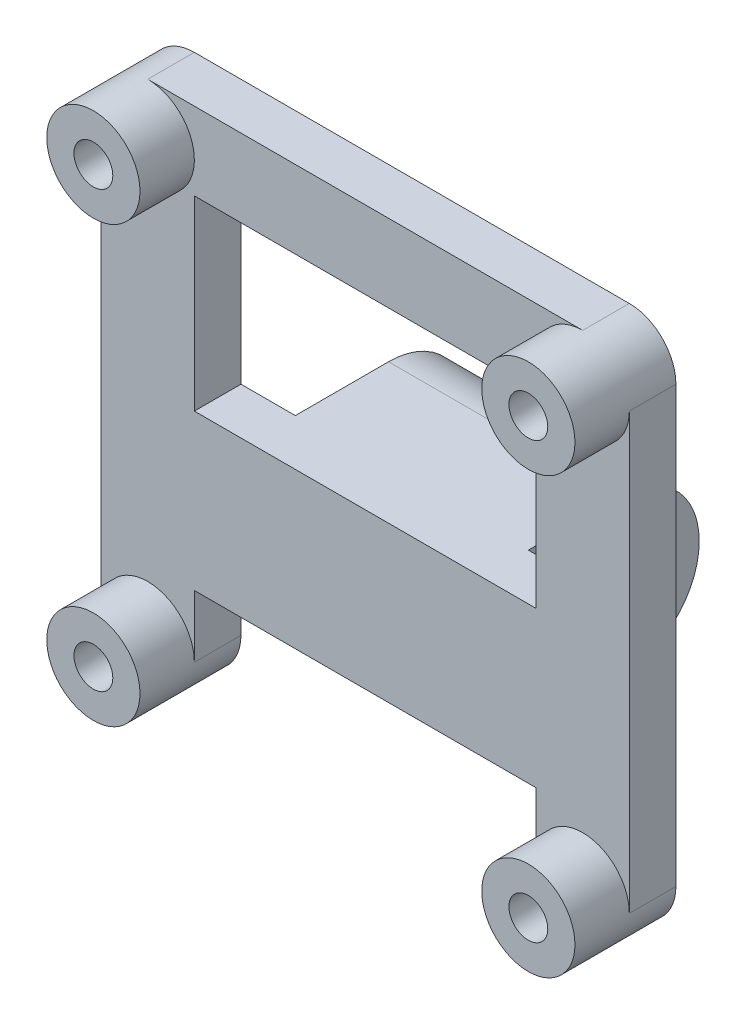
ISO-10303-21;
HEADER;
FILE_DESCRIPTION(('STEP AP214'),'2;1');
FILE_NAME('part.step','',(''),(''),'','','');
FILE_SCHEMA(('AUTOMOTIVE_DESIGN { 1 0 10303 214 1 1 1 1 }'));
ENDSEC;
DATA;
#1=APPLICATION_CONTEXT('core data for automotive mechanical design processes');
#2=APPLICATION_PROTOCOL_DEFINITION('international standard','automotive_design',2000,#1);
#3=PRODUCT_CONTEXT('',#1,'mechanical');
#4=PRODUCT('Part','Part','',(#3));
#5=PRODUCT_RELATED_PRODUCT_CATEGORY('part','',(#4));
#6=PRODUCT_DEFINITION_FORMATION('','',#4);
#7=PRODUCT_DEFINITION_CONTEXT('part definition',#1,'design');
#8=PRODUCT_DEFINITION('design','',#6,#7);
#9=PRODUCT_DEFINITION_SHAPE('','',#8);
#10=(LENGTH_UNIT() NAMED_UNIT(*) SI_UNIT(.MILLI.,.METRE.));
#11=(NAMED_UNIT(*) PLANE_ANGLE_UNIT() SI_UNIT($,.RADIAN.));
#12=(NAMED_UNIT(*) SI_UNIT($,.STERADIAN.) SOLID_ANGLE_UNIT());
#13=UNCERTAINTY_MEASURE_WITH_UNIT(LENGTH_MEASURE(1.E-05),#10,'distance_accuracy_value','');
#14=(GEOMETRIC_REPRESENTATION_CONTEXT(3) GLOBAL_UNCERTAINTY_ASSIGNED_CONTEXT((#13)) GLOBAL_UNIT_ASSIGNED_CONTEXT((#10,
#11,#12)) REPRESENTATION_CONTEXT('',''));
#15=CARTESIAN_POINT('',(0.,0.,0.));
#16=DIRECTION('',(0.,0.,1.));
#17=DIRECTION('',(1.,0.,0.));
#18=AXIS2_PLACEMENT_3D('',#15,#16,#17);
#19=CARTESIAN_POINT('',(14.,-18.,3.));
#20=DIRECTION('',(0.,0.,1.));
#21=DIRECTION('',(1.,0.,0.));
#22=AXIS2_PLACEMENT_3D('',#19,#20,#21);
#23=PLANE('',#22);
#24=DIRECTION('',(0.,-1.,0.));
#25=VECTOR('',#24,1.);
#26=CARTESIAN_POINT('',(11.,-14.,3.));
#27=LINE('',#26,#25);
#28=CARTESIAN_POINT('',(11.,-14.,3.));
#29=VERTEX_POINT('',#28);
#30=CARTESIAN_POINT('',(11.,-18.,3.));
#31=VERTEX_POINT('',#30);
#32=EDGE_CURVE('E274',#29,#31,#27,.T.);
#33=ORIENTED_EDGE('',*,*,#32,.T.);
#34=CARTESIAN_POINT('',(14.,-18.,3.));
#35=DIRECTION('',(0.,0.,1.));
#36=DIRECTION('',(1.,0.,0.));
#37=AXIS2_PLACEMENT_3D('',#34,#35,#36);
#38=CIRCLE('',#37,3.);
#39=CARTESIAN_POINT('',(17.,-18.,3.));
#40=VERTEX_POINT('',#39);
#41=EDGE_CURVE('E211',#40,#31,#38,.T.);
#42=ORIENTED_EDGE('',*,*,#41,.F.);
#43=DIRECTION('',(0.,1.,0.));
#44=VECTOR('',#43,1.);
#45=CARTESIAN_POINT('',(17.,10.,3.));
#46=LINE('',#45,#44);
#47=CARTESIAN_POINT('',(17.,10.,3.));
#48=VERTEX_POINT('',#47);
#49=EDGE_CURVE('E262',#40,#48,#46,.T.);
#50=ORIENTED_EDGE('',*,*,#49,.T.);
#51=CARTESIAN_POINT('',(14.,10.,3.));
#52=DIRECTION('',(0.,0.,1.));
#53=DIRECTION('',(1.,0.,0.));
#54=AXIS2_PLACEMENT_3D('',#51,#52,#53);
#55=CIRCLE('',#54,3.);
#56=CARTESIAN_POINT('',(14.,13.,3.));
#57=VERTEX_POINT('',#56);
#58=EDGE_CURVE('E11',#57,#48,#55,.T.);
#59=ORIENTED_EDGE('',*,*,#58,.F.);
#60=DIRECTION('',(-1.,0.,0.));
#61=VECTOR('',#60,1.);
#62=CARTESIAN_POINT('',(14.,13.,3.));
#63=LINE('',#62,#61);
#64=CARTESIAN_POINT('',(-14.,13.,3.));
#65=VERTEX_POINT('',#64);
#66=EDGE_CURVE('E265',#57,#65,#63,.T.);
#67=ORIENTED_EDGE('',*,*,#66,.T.);
#68=CARTESIAN_POINT('',(-14.,10.,3.));
#69=DIRECTION('',(0.,0.,1.));
#70=DIRECTION('',(1.,0.,0.));
#71=AXIS2_PLACEMENT_3D('',#68,#69,#70);
#72=CIRCLE('',#71,3.);
#73=CARTESIAN_POINT('',(-17.,9.99999999999999,3.));
#74=VERTEX_POINT('',#73);
#75=EDGE_CURVE('E223',#74,#65,#72,.T.);
#76=ORIENTED_EDGE('',*,*,#75,.F.);
#77=DIRECTION('',(0.,-1.,0.));
#78=VECTOR('',#77,1.);
#79=CARTESIAN_POINT('',(-17.,-14.,3.));
#80=LINE('',#79,#78);
#81=CARTESIAN_POINT('',(-17.,-18.,3.));
#82=VERTEX_POINT('',#81);
#83=EDGE_CURVE('E268',#74,#82,#80,.T.);
#84=ORIENTED_EDGE('',*,*,#83,.T.);
#85=CARTESIAN_POINT('',(-14.,-18.,3.));
#86=DIRECTION('',(0.,0.,1.));
#87=DIRECTION('',(1.,0.,0.));
#88=AXIS2_PLACEMENT_3D('',#85,#86,#87);
#89=CIRCLE('',#88,3.);
#90=CARTESIAN_POINT('',(-11.,-18.,3.));
#91=VERTEX_POINT('',#90);
#92=EDGE_CURVE('E217',#91,#82,#89,.T.);
#93=ORIENTED_EDGE('',*,*,#92,.F.);
#94=DIRECTION('',(0.,1.,0.));
#95=VECTOR('',#94,1.);
#96=CARTESIAN_POINT('',(-11.,-18.,3.));
#97=LINE('',#96,#95);
#98=CARTESIAN_POINT('',(-11.,-14.,3.));
#99=VERTEX_POINT('',#98);
#100=EDGE_CURVE('E270',#91,#99,#97,.T.);
#101=ORIENTED_EDGE('',*,*,#100,.T.);
#102=DIRECTION('',(1.,0.,0.));
#103=VECTOR('',#102,1.);
#104=CARTESIAN_POINT('',(-11.,-14.,3.));
#105=LINE('',#104,#103);
#106=EDGE_CURVE('E272',#99,#29,#105,.T.);
#107=ORIENTED_EDGE('',*,*,#106,.T.);
#108=EDGE_LOOP('',(#33,#42,#50,#59,#67,#76,#84,#93,#101,#107));
#109=FACE_BOUND('',#108,.T.);
#110=DIRECTION('',(-1.,0.,0.));
#111=VECTOR('',#110,1.);
#112=CARTESIAN_POINT('',(-11.,8.,3.));
#113=LINE('',#112,#111);
#114=CARTESIAN_POINT('',(11.,8.,3.));
#115=VERTEX_POINT('',#114);
#116=CARTESIAN_POINT('',(-11.,8.,3.));
#117=VERTEX_POINT('',#116);
#118=EDGE_CURVE('E237',#115,#117,#113,.T.);
#119=ORIENTED_EDGE('',*,*,#118,.F.);
#120=DIRECTION('',(0.,1.,0.));
#121=VECTOR('',#120,1.);
#122=CARTESIAN_POINT('',(11.,8.,3.));
#123=LINE('',#122,#121);
#124=CARTESIAN_POINT('',(11.,-3.99999999999999,3.));
#125=VERTEX_POINT('',#124);
#126=EDGE_CURVE('E235',#125,#115,#123,.T.);
#127=ORIENTED_EDGE('',*,*,#126,.F.);
#128=DIRECTION('',(1.,0.,0.));
#129=VECTOR('',#128,1.);
#130=CARTESIAN_POINT('',(11.,-3.99999999999999,3.));
#131=LINE('',#130,#129);
#132=CARTESIAN_POINT('',(-11.,-4.,3.));
#133=VERTEX_POINT('',#132);
#134=EDGE_CURVE('E242',#133,#125,#131,.T.);
#135=ORIENTED_EDGE('',*,*,#134,.F.);
#136=DIRECTION('',(0.,-1.,0.));
#137=VECTOR('',#136,1.);
#138=CARTESIAN_POINT('',(-11.,-4.,3.));
#139=LINE('',#138,#137);
#140=EDGE_CURVE('E239',#117,#133,#139,.T.);
#141=ORIENTED_EDGE('',*,*,#140,.F.);
#142=EDGE_LOOP('',(#119,#127,#135,#141));
#143=FACE_BOUND('',#142,.T.);
#144=ADVANCED_FACE('F34',(#109,#143),#23,.T.);
#145=CARTESIAN_POINT('',(14.,-18.,0.));
#146=DIRECTION('',(0.,0.,1.));
#147=DIRECTION('',(1.,0.,0.));
#148=AXIS2_PLACEMENT_3D('',#145,#146,#147);
#149=PLANE('',#148);
#150=CARTESIAN_POINT('',(14.,10.,0.));
#151=DIRECTION('',(0.,0.,1.));
#152=DIRECTION('',(1.,0.,0.));
#153=AXIS2_PLACEMENT_3D('',#150,#151,#152);
#154=CIRCLE('',#153,1.25);
#155=CARTESIAN_POINT('',(15.25,10.,0.));
#156=VERTEX_POINT('',#155);
#157=EDGE_CURVE('E196',#156,#156,#154,.T.);
#158=ORIENTED_EDGE('',*,*,#157,.T.);
#159=EDGE_LOOP('',(#158));
#160=FACE_BOUND('',#159,.T.);
#161=CARTESIAN_POINT('',(-14.,-18.,0.));
#162=DIRECTION('',(0.,0.,1.));
#163=DIRECTION('',(1.,0.,0.));
#164=AXIS2_PLACEMENT_3D('',#161,#162,#163);
#165=CIRCLE('',#164,1.25);
#166=CARTESIAN_POINT('',(-12.75,-18.,0.));
#167=VERTEX_POINT('',#166);
#168=EDGE_CURVE('E203',#167,#167,#165,.T.);
#169=ORIENTED_EDGE('',*,*,#168,.T.);
#170=EDGE_LOOP('',(#169));
#171=FACE_BOUND('',#170,.T.);
#172=CARTESIAN_POINT('',(14.,-18.,0.));
#173=DIRECTION('',(0.,0.,1.));
#174=DIRECTION('',(1.,0.,0.));
#175=AXIS2_PLACEMENT_3D('',#172,#173,#174);
#176=CIRCLE('',#175,1.25);
#177=CARTESIAN_POINT('',(15.25,-18.,0.));
#178=VERTEX_POINT('',#177);
#179=EDGE_CURVE('E188',#178,#178,#176,.T.);
#180=ORIENTED_EDGE('',*,*,#179,.T.);
#181=EDGE_LOOP('',(#180));
#182=FACE_BOUND('',#181,.T.);
#183=CARTESIAN_POINT('',(-14.,10.,0.));
#184=DIRECTION('',(0.,0.,1.));
#185=DIRECTION('',(1.,0.,0.));
#186=AXIS2_PLACEMENT_3D('',#183,#184,#185);
#187=CIRCLE('',#186,1.25);
#188=CARTESIAN_POINT('',(-12.75,10.,0.));
#189=VERTEX_POINT('',#188);
#190=EDGE_CURVE('E208',#189,#189,#187,.T.);
#191=ORIENTED_EDGE('',*,*,#190,.T.);
#192=EDGE_LOOP('',(#191));
#193=FACE_BOUND('',#192,.T.);
#194=DIRECTION('',(1.,0.,0.));
#195=VECTOR('',#194,1.);
#196=CARTESIAN_POINT('',(11.,-3.99999999999999,0.));
#197=LINE('',#196,#195);
#198=CARTESIAN_POINT('',(-11.,-4.,0.));
#199=VERTEX_POINT('',#198);
#200=CARTESIAN_POINT('',(-7.5,-4.,0.));
#201=VERTEX_POINT('',#200);
#202=EDGE_CURVE('E58',#199,#201,#197,.T.);
#203=ORIENTED_EDGE('',*,*,#202,.T.);
#204=DIRECTION('',(0.,-1.,0.));
#205=VECTOR('',#204,1.);
#206=CARTESIAN_POINT('',(-7.5,-14.,0.));
#207=LINE('',#206,#205);
#208=CARTESIAN_POINT('',(-7.5,-14.,0.));
#209=VERTEX_POINT('',#208);
#210=EDGE_CURVE('E369',#201,#209,#207,.T.);
#211=ORIENTED_EDGE('',*,*,#210,.T.);
#212=DIRECTION('',(1.,0.,0.));
#213=VECTOR('',#212,1.);
#214=CARTESIAN_POINT('',(-11.,-14.,0.));
#215=LINE('',#214,#213);
#216=CARTESIAN_POINT('',(-11.,-14.,0.));
#217=VERTEX_POINT('',#216);
#218=EDGE_CURVE('E290',#217,#209,#215,.T.);
#219=ORIENTED_EDGE('',*,*,#218,.F.);
#220=DIRECTION('',(0.,1.,0.));
#221=VECTOR('',#220,1.);
#222=CARTESIAN_POINT('',(-11.,-18.,0.));
#223=LINE('',#222,#221);
#224=CARTESIAN_POINT('',(-11.,-18.,0.));
#225=VERTEX_POINT('',#224);
#226=EDGE_CURVE('E287',#225,#217,#223,.T.);
#227=ORIENTED_EDGE('',*,*,#226,.F.);
#228=CARTESIAN_POINT('',(-14.,-18.,0.));
#229=DIRECTION('',(0.,0.,1.));
#230=DIRECTION('',(1.,0.,0.));
#231=AXIS2_PLACEMENT_3D('',#228,#229,#230);
#232=CIRCLE('',#231,3.);
#233=CARTESIAN_POINT('',(-17.,-18.,0.));
#234=VERTEX_POINT('',#233);
#235=EDGE_CURVE('E285',#234,#225,#232,.T.);
#236=ORIENTED_EDGE('',*,*,#235,.F.);
#237=DIRECTION('',(0.,-1.,0.));
#238=VECTOR('',#237,1.);
#239=CARTESIAN_POINT('',(-17.,-14.,0.));
#240=LINE('',#239,#238);
#241=CARTESIAN_POINT('',(-17.,10.,0.));
#242=VERTEX_POINT('',#241);
#243=EDGE_CURVE('E283',#242,#234,#240,.T.);
#244=ORIENTED_EDGE('',*,*,#243,.F.);
#245=CARTESIAN_POINT('',(-14.,10.,0.));
#246=DIRECTION('',(0.,0.,1.));
#247=DIRECTION('',(1.,0.,0.));
#248=AXIS2_PLACEMENT_3D('',#245,#246,#247);
#249=CIRCLE('',#248,3.);
#250=CARTESIAN_POINT('',(-14.,13.,0.));
#251=VERTEX_POINT('',#250);
#252=EDGE_CURVE('E280',#251,#242,#249,.T.);
#253=ORIENTED_EDGE('',*,*,#252,.F.);
#254=DIRECTION('',(-1.,0.,0.));
#255=VECTOR('',#254,1.);
#256=CARTESIAN_POINT('',(14.,13.,0.));
#257=LINE('',#256,#255);
#258=CARTESIAN_POINT('',(14.,13.,0.));
#259=VERTEX_POINT('',#258);
#260=EDGE_CURVE('E278',#259,#251,#257,.T.);
#261=ORIENTED_EDGE('',*,*,#260,.F.);
#262=CARTESIAN_POINT('',(14.,10.,0.));
#263=DIRECTION('',(0.,0.,1.));
#264=DIRECTION('',(-1.,0.,0.));
#265=AXIS2_PLACEMENT_3D('',#262,#263,#264);
#266=CIRCLE('',#265,3.);
#267=CARTESIAN_POINT('',(17.,10.,0.));
#268=VERTEX_POINT('',#267);
#269=EDGE_CURVE('E261',#268,#259,#266,.T.);
#270=ORIENTED_EDGE('',*,*,#269,.F.);
#271=DIRECTION('',(0.,1.,0.));
#272=VECTOR('',#271,1.);
#273=CARTESIAN_POINT('',(17.,-14.,0.));
#274=LINE('',#273,#272);
#275=CARTESIAN_POINT('',(17.,-18.,0.));
#276=VERTEX_POINT('',#275);
#277=EDGE_CURVE('E266',#276,#268,#274,.T.);
#278=ORIENTED_EDGE('',*,*,#277,.F.);
#279=CARTESIAN_POINT('',(14.,-18.,0.));
#280=DIRECTION('',(0.,0.,1.));
#281=DIRECTION('',(1.,0.,0.));
#282=AXIS2_PLACEMENT_3D('',#279,#280,#281);
#283=CIRCLE('',#282,3.);
#284=CARTESIAN_POINT('',(11.,-18.,0.));
#285=VERTEX_POINT('',#284);
#286=EDGE_CURVE('E295',#285,#276,#283,.T.);
#287=ORIENTED_EDGE('',*,*,#286,.F.);
#288=DIRECTION('',(0.,-1.,0.));
#289=VECTOR('',#288,1.);
#290=CARTESIAN_POINT('',(11.,-14.,0.));
#291=LINE('',#290,#289);
#292=CARTESIAN_POINT('',(11.,-14.,0.));
#293=VERTEX_POINT('',#292);
#294=EDGE_CURVE('E293',#293,#285,#291,.T.);
#295=ORIENTED_EDGE('',*,*,#294,.F.);
#296=CARTESIAN_POINT('',(7.5,-14.,0.));
#297=VERTEX_POINT('',#296);
#298=EDGE_CURVE('E289',#297,#293,#215,.T.);
#299=ORIENTED_EDGE('',*,*,#298,.F.);
#300=DIRECTION('',(0.,-1.,0.));
#301=VECTOR('',#300,1.);
#302=CARTESIAN_POINT('',(7.5,-14.,0.));
#303=LINE('',#302,#301);
#304=CARTESIAN_POINT('',(7.5,-4.,0.));
#305=VERTEX_POINT('',#304);
#306=EDGE_CURVE('E51',#305,#297,#303,.T.);
#307=ORIENTED_EDGE('',*,*,#306,.F.);
#308=CARTESIAN_POINT('',(11.,-4.,0.));
#309=VERTEX_POINT('',#308);
#310=EDGE_CURVE('E168',#305,#309,#197,.T.);
#311=ORIENTED_EDGE('',*,*,#310,.T.);
#312=DIRECTION('',(0.,1.,0.));
#313=VECTOR('',#312,1.);
#314=CARTESIAN_POINT('',(11.,8.,0.));
#315=LINE('',#314,#313);
#316=CARTESIAN_POINT('',(11.,8.,0.));
#317=VERTEX_POINT('',#316);
#318=EDGE_CURVE('E233',#309,#317,#315,.T.);
#319=ORIENTED_EDGE('',*,*,#318,.T.);
#320=DIRECTION('',(-1.,0.,0.));
#321=VECTOR('',#320,1.);
#322=CARTESIAN_POINT('',(-11.,8.,0.));
#323=LINE('',#322,#321);
#324=CARTESIAN_POINT('',(-11.,8.,0.));
#325=VERTEX_POINT('',#324);
#326=EDGE_CURVE('E247',#317,#325,#323,.T.);
#327=ORIENTED_EDGE('',*,*,#326,.T.);
#328=DIRECTION('',(0.,-1.,0.));
#329=VECTOR('',#328,1.);
#330=CARTESIAN_POINT('',(-11.,-4.,0.));
#331=LINE('',#330,#329);
#332=EDGE_CURVE('E250',#325,#199,#331,.T.);
#333=ORIENTED_EDGE('',*,*,#332,.T.);
#334=EDGE_LOOP('',(#203,#211,#219,#227,#236,#244,#253,#261,#270,#278,#287,#295,#299,#307,#311,
#319,#327,#333));
#335=FACE_BOUND('',#334,.T.);
#336=ADVANCED_FACE('F341',(#160,#171,#182,#193,#335),#149,.F.);
#337=CARTESIAN_POINT('',(14.,10.,3.));
#338=DIRECTION('',(0.,0.,-1.));
#339=DIRECTION('',(-1.,0.,0.));
#340=AXIS2_PLACEMENT_3D('',#337,#338,#339);
#341=CYLINDRICAL_SURFACE('',#340,3.);
#342=ORIENTED_EDGE('',*,*,#269,.T.);
#343=DIRECTION('',(0.,0.,-1.));
#344=VECTOR('',#343,1.);
#345=CARTESIAN_POINT('',(14.,13.,3.));
#346=LINE('',#345,#344);
#347=EDGE_CURVE('E321',#57,#259,#346,.T.);
#348=ORIENTED_EDGE('',*,*,#347,.F.);
#349=ORIENTED_EDGE('',*,*,#58,.T.);
#350=DIRECTION('',(0.,0.,-1.));
#351=VECTOR('',#350,1.);
#352=CARTESIAN_POINT('',(17.,10.,3.));
#353=LINE('',#352,#351);
#354=EDGE_CURVE('E43',#48,#268,#353,.T.);
#355=ORIENTED_EDGE('',*,*,#354,.T.);
#356=EDGE_LOOP('',(#342,#348,#349,#355));
#357=FACE_BOUND('',#356,.T.);
#358=CARTESIAN_POINT('',(14.,10.,6.5));
#359=DIRECTION('',(0.,0.,1.));
#360=DIRECTION('',(1.,0.,0.));
#361=AXIS2_PLACEMENT_3D('',#358,#359,#360);
#362=CIRCLE('',#361,3.);
#363=CARTESIAN_POINT('',(17.,10.,6.5));
#364=VERTEX_POINT('',#363);
#365=EDGE_CURVE('E229',#364,#364,#362,.T.);
#366=ORIENTED_EDGE('',*,*,#365,.F.);
#367=EDGE_LOOP('',(#366));
#368=FACE_BOUND('',#367,.T.);
#369=ADVANCED_FACE('F36',(#357,#368),#341,.T.);
#370=CARTESIAN_POINT('',(14.,13.,3.));
#371=DIRECTION('',(0.,-1.,0.));
#372=DIRECTION('',(1.,0.,0.));
#373=AXIS2_PLACEMENT_3D('',#370,#371,#372);
#374=PLANE('',#373);
#375=ORIENTED_EDGE('',*,*,#260,.T.);
#376=DIRECTION('',(0.,0.,-1.));
#377=VECTOR('',#376,1.);
#378=CARTESIAN_POINT('',(-14.,13.,3.));
#379=LINE('',#378,#377);
#380=EDGE_CURVE('E318',#65,#251,#379,.T.);
#381=ORIENTED_EDGE('',*,*,#380,.F.);
#382=ORIENTED_EDGE('',*,*,#66,.F.);
#383=ORIENTED_EDGE('',*,*,#347,.T.);
#384=EDGE_LOOP('',(#375,#381,#382,#383));
#385=FACE_BOUND('',#384,.T.);
#386=ADVANCED_FACE('F347',(#385),#374,.F.);
#387=CARTESIAN_POINT('',(-14.,10.,3.));
#388=DIRECTION('',(0.,0.,-1.));
#389=DIRECTION('',(-1.,0.,0.));
#390=AXIS2_PLACEMENT_3D('',#387,#388,#389);
#391=CYLINDRICAL_SURFACE('',#390,3.);
#392=ORIENTED_EDGE('',*,*,#252,.T.);
#393=DIRECTION('',(0.,0.,-1.));
#394=VECTOR('',#393,1.);
#395=CARTESIAN_POINT('',(-17.,10.,3.));
#396=LINE('',#395,#394);
#397=EDGE_CURVE('E315',#74,#242,#396,.T.);
#398=ORIENTED_EDGE('',*,*,#397,.F.);
#399=ORIENTED_EDGE('',*,*,#75,.T.);
#400=ORIENTED_EDGE('',*,*,#380,.T.);
#401=EDGE_LOOP('',(#392,#398,#399,#400));
#402=FACE_BOUND('',#401,.T.);
#403=CARTESIAN_POINT('',(-14.,10.,6.5));
#404=DIRECTION('',(0.,0.,1.));
#405=DIRECTION('',(1.,0.,0.));
#406=AXIS2_PLACEMENT_3D('',#403,#404,#405);
#407=CIRCLE('',#406,3.);
#408=CARTESIAN_POINT('',(-11.,10.,6.5));
#409=VERTEX_POINT('',#408);
#410=EDGE_CURVE('E226',#409,#409,#407,.T.);
#411=ORIENTED_EDGE('',*,*,#410,.F.);
#412=EDGE_LOOP('',(#411));
#413=FACE_BOUND('',#412,.T.);
#414=ADVANCED_FACE('F350',(#402,#413),#391,.T.);
#415=CARTESIAN_POINT('',(-17.,-14.,3.));
#416=DIRECTION('',(1.,0.,0.));
#417=DIRECTION('',(0.,1.,0.));
#418=AXIS2_PLACEMENT_3D('',#415,#416,#417);
#419=PLANE('',#418);
#420=ORIENTED_EDGE('',*,*,#243,.T.);
#421=DIRECTION('',(0.,0.,-1.));
#422=VECTOR('',#421,1.);
#423=CARTESIAN_POINT('',(-17.,-18.,3.));
#424=LINE('',#423,#422);
#425=EDGE_CURVE('E312',#82,#234,#424,.T.);
#426=ORIENTED_EDGE('',*,*,#425,.F.);
#427=ORIENTED_EDGE('',*,*,#83,.F.);
#428=ORIENTED_EDGE('',*,*,#397,.T.);
#429=EDGE_LOOP('',(#420,#426,#427,#428));
#430=FACE_BOUND('',#429,.T.);
#431=ADVANCED_FACE('F357',(#430),#419,.F.);
#432=CARTESIAN_POINT('',(-14.,-18.,3.));
#433=DIRECTION('',(0.,0.,-1.));
#434=DIRECTION('',(-1.,0.,0.));
#435=AXIS2_PLACEMENT_3D('',#432,#433,#434);
#436=CYLINDRICAL_SURFACE('',#435,3.);
#437=ORIENTED_EDGE('',*,*,#235,.T.);
#438=DIRECTION('',(0.,0.,-1.));
#439=VECTOR('',#438,1.);
#440=CARTESIAN_POINT('',(-11.,-18.,3.));
#441=LINE('',#440,#439);
#442=EDGE_CURVE('E309',#91,#225,#441,.T.);
#443=ORIENTED_EDGE('',*,*,#442,.F.);
#444=ORIENTED_EDGE('',*,*,#92,.T.);
#445=ORIENTED_EDGE('',*,*,#425,.T.);
#446=EDGE_LOOP('',(#437,#443,#444,#445));
#447=FACE_BOUND('',#446,.T.);
#448=CARTESIAN_POINT('',(-14.,-18.,6.5));
#449=DIRECTION('',(0.,0.,1.));
#450=DIRECTION('',(1.,0.,0.));
#451=AXIS2_PLACEMENT_3D('',#448,#449,#450);
#452=CIRCLE('',#451,3.);
#453=CARTESIAN_POINT('',(-11.,-18.,6.5));
#454=VERTEX_POINT('',#453);
#455=EDGE_CURVE('E220',#454,#454,#452,.T.);
#456=ORIENTED_EDGE('',*,*,#455,.F.);
#457=EDGE_LOOP('',(#456));
#458=FACE_BOUND('',#457,.T.);
#459=ADVANCED_FACE('F361',(#447,#458),#436,.T.);
#460=CARTESIAN_POINT('',(-11.,-18.,3.));
#461=DIRECTION('',(-1.,0.,0.));
#462=DIRECTION('',(0.,-1.,0.));
#463=AXIS2_PLACEMENT_3D('',#460,#461,#462);
#464=PLANE('',#463);
#465=ORIENTED_EDGE('',*,*,#226,.T.);
#466=DIRECTION('',(0.,0.,-1.));
#467=VECTOR('',#466,1.);
#468=CARTESIAN_POINT('',(-11.,-14.,3.));
#469=LINE('',#468,#467);
#470=EDGE_CURVE('E306',#99,#217,#469,.T.);
#471=ORIENTED_EDGE('',*,*,#470,.F.);
#472=ORIENTED_EDGE('',*,*,#100,.F.);
#473=ORIENTED_EDGE('',*,*,#442,.T.);
#474=EDGE_LOOP('',(#465,#471,#472,#473));
#475=FACE_BOUND('',#474,.T.);
#476=ADVANCED_FACE('F365',(#475),#464,.F.);
#477=CARTESIAN_POINT('',(-11.,-14.,3.));
#478=DIRECTION('',(0.,1.,0.));
#479=DIRECTION('',(-1.,0.,0.));
#480=AXIS2_PLACEMENT_3D('',#477,#478,#479);
#481=PLANE('',#480);
#482=ORIENTED_EDGE('',*,*,#218,.T.);
#483=DIRECTION('',(0.,0.,-1.));
#484=VECTOR('',#483,1.);
#485=CARTESIAN_POINT('',(-7.5,-14.,-6.));
#486=LINE('',#485,#484);
#487=CARTESIAN_POINT('',(-7.5,-14.,-6.));
#488=VERTEX_POINT('',#487);
#489=EDGE_CURVE('E179',#209,#488,#486,.T.);
#490=ORIENTED_EDGE('',*,*,#489,.T.);
#491=DIRECTION('',(-1.,0.,0.));
#492=VECTOR('',#491,1.);
#493=CARTESIAN_POINT('',(7.5,-14.,-6.));
#494=LINE('',#493,#492);
#495=CARTESIAN_POINT('',(7.5,-14.,-6.));
#496=VERTEX_POINT('',#495);
#497=EDGE_CURVE('E185',#496,#488,#494,.T.);
#498=ORIENTED_EDGE('',*,*,#497,.F.);
#499=DIRECTION('',(0.,0.,-1.));
#500=VECTOR('',#499,1.);
#501=CARTESIAN_POINT('',(7.5,-14.,-6.));
#502=LINE('',#501,#500);
#503=EDGE_CURVE('E175',#297,#496,#502,.T.);
#504=ORIENTED_EDGE('',*,*,#503,.F.);
#505=ORIENTED_EDGE('',*,*,#298,.T.);
#506=DIRECTION('',(0.,0.,-1.));
#507=VECTOR('',#506,1.);
#508=CARTESIAN_POINT('',(11.,-14.,3.));
#509=LINE('',#508,#507);
#510=EDGE_CURVE('E303',#29,#293,#509,.T.);
#511=ORIENTED_EDGE('',*,*,#510,.F.);
#512=ORIENTED_EDGE('',*,*,#106,.F.);
#513=ORIENTED_EDGE('',*,*,#470,.T.);
#514=EDGE_LOOP('',(#482,#490,#498,#504,#505,#511,#512,#513));
#515=FACE_BOUND('',#514,.T.);
#516=ADVANCED_FACE('F372',(#515),#481,.F.);
#517=CARTESIAN_POINT('',(11.,-14.,3.));
#518=DIRECTION('',(1.,0.,0.));
#519=DIRECTION('',(0.,1.,0.));
#520=AXIS2_PLACEMENT_3D('',#517,#518,#519);
#521=PLANE('',#520);
#522=ORIENTED_EDGE('',*,*,#294,.T.);
#523=DIRECTION('',(0.,0.,-1.));
#524=VECTOR('',#523,1.);
#525=CARTESIAN_POINT('',(11.,-18.,3.));
#526=LINE('',#525,#524);
#527=EDGE_CURVE('E300',#31,#285,#526,.T.);
#528=ORIENTED_EDGE('',*,*,#527,.F.);
#529=ORIENTED_EDGE('',*,*,#32,.F.);
#530=ORIENTED_EDGE('',*,*,#510,.T.);
#531=EDGE_LOOP('',(#522,#528,#529,#530));
#532=FACE_BOUND('',#531,.T.);
#533=ADVANCED_FACE('F417',(#532),#521,.F.);
#534=CARTESIAN_POINT('',(14.,-18.,3.));
#535=DIRECTION('',(0.,0.,-1.));
#536=DIRECTION('',(-1.,0.,0.));
#537=AXIS2_PLACEMENT_3D('',#534,#535,#536);
#538=CYLINDRICAL_SURFACE('',#537,3.);
#539=ORIENTED_EDGE('',*,*,#286,.T.);
#540=DIRECTION('',(0.,0.,-1.));
#541=VECTOR('',#540,1.);
#542=CARTESIAN_POINT('',(17.,-18.,3.));
#543=LINE('',#542,#541);
#544=EDGE_CURVE('E276',#40,#276,#543,.T.);
#545=ORIENTED_EDGE('',*,*,#544,.F.);
#546=ORIENTED_EDGE('',*,*,#41,.T.);
#547=ORIENTED_EDGE('',*,*,#527,.T.);
#548=EDGE_LOOP('',(#539,#545,#546,#547));
#549=FACE_BOUND('',#548,.T.);
#550=CARTESIAN_POINT('',(14.,-18.,6.5));
#551=DIRECTION('',(0.,0.,1.));
#552=DIRECTION('',(1.,0.,0.));
#553=AXIS2_PLACEMENT_3D('',#550,#551,#552);
#554=CIRCLE('',#553,3.);
#555=CARTESIAN_POINT('',(17.,-18.,6.5));
#556=VERTEX_POINT('',#555);
#557=EDGE_CURVE('E214',#556,#556,#554,.T.);
#558=ORIENTED_EDGE('',*,*,#557,.F.);
#559=EDGE_LOOP('',(#558));
#560=FACE_BOUND('',#559,.T.);
#561=ADVANCED_FACE('F338',(#549,#560),#538,.T.);
#562=CARTESIAN_POINT('',(17.,-14.,3.));
#563=DIRECTION('',(-1.,0.,0.));
#564=DIRECTION('',(0.,0.,1.));
#565=AXIS2_PLACEMENT_3D('',#562,#563,#564);
#566=PLANE('',#565);
#567=ORIENTED_EDGE('',*,*,#277,.T.);
#568=ORIENTED_EDGE('',*,*,#354,.F.);
#569=ORIENTED_EDGE('',*,*,#49,.F.);
#570=ORIENTED_EDGE('',*,*,#544,.T.);
#571=EDGE_LOOP('',(#567,#568,#569,#570));
#572=FACE_BOUND('',#571,.T.);
#573=ADVANCED_FACE('F330',(#572),#566,.F.);
#574=CARTESIAN_POINT('',(11.,8.,3.));
#575=DIRECTION('',(-1.,0.,0.));
#576=DIRECTION('',(0.,-1.,0.));
#577=AXIS2_PLACEMENT_3D('',#574,#575,#576);
#578=PLANE('',#577);
#579=ORIENTED_EDGE('',*,*,#318,.F.);
#580=DIRECTION('',(0.,0.,-1.));
#581=VECTOR('',#580,1.);
#582=CARTESIAN_POINT('',(11.,-3.99999999999999,3.));
#583=LINE('',#582,#581);
#584=EDGE_CURVE('E244',#125,#309,#583,.T.);
#585=ORIENTED_EDGE('',*,*,#584,.F.);
#586=ORIENTED_EDGE('',*,*,#126,.T.);
#587=DIRECTION('',(0.,0.,-1.));
#588=VECTOR('',#587,1.);
#589=CARTESIAN_POINT('',(11.,8.,3.));
#590=LINE('',#589,#588);
#591=EDGE_CURVE('E258',#115,#317,#590,.T.);
#592=ORIENTED_EDGE('',*,*,#591,.T.);
#593=EDGE_LOOP('',(#579,#585,#586,#592));
#594=FACE_BOUND('',#593,.T.);
#595=ADVANCED_FACE('F410',(#594),#578,.T.);
#596=CARTESIAN_POINT('',(-11.,8.,3.));
#597=DIRECTION('',(0.,-1.,0.));
#598=DIRECTION('',(0.,0.,-1.));
#599=AXIS2_PLACEMENT_3D('',#596,#597,#598);
#600=PLANE('',#599);
#601=ORIENTED_EDGE('',*,*,#326,.F.);
#602=ORIENTED_EDGE('',*,*,#591,.F.);
#603=ORIENTED_EDGE('',*,*,#118,.T.);
#604=DIRECTION('',(0.,0.,-1.));
#605=VECTOR('',#604,1.);
#606=CARTESIAN_POINT('',(-11.,8.,3.));
#607=LINE('',#606,#605);
#608=EDGE_CURVE('E256',#117,#325,#607,.T.);
#609=ORIENTED_EDGE('',*,*,#608,.T.);
#610=EDGE_LOOP('',(#601,#602,#603,#609));
#611=FACE_BOUND('',#610,.T.);
#612=ADVANCED_FACE('F606',(#611),#600,.T.);
#613=CARTESIAN_POINT('',(-11.,-4.,3.));
#614=DIRECTION('',(1.,0.,0.));
#615=DIRECTION('',(0.,0.,-1.));
#616=AXIS2_PLACEMENT_3D('',#613,#614,#615);
#617=PLANE('',#616);
#618=ORIENTED_EDGE('',*,*,#332,.F.);
#619=ORIENTED_EDGE('',*,*,#608,.F.);
#620=ORIENTED_EDGE('',*,*,#140,.T.);
#621=DIRECTION('',(0.,0.,-1.));
#622=VECTOR('',#621,1.);
#623=CARTESIAN_POINT('',(-11.,-4.,3.));
#624=LINE('',#623,#622);
#625=EDGE_CURVE('E254',#133,#199,#624,.T.);
#626=ORIENTED_EDGE('',*,*,#625,.T.);
#627=EDGE_LOOP('',(#618,#619,#620,#626));
#628=FACE_BOUND('',#627,.T.);
#629=ADVANCED_FACE('F465',(#628),#617,.T.);
#630=CARTESIAN_POINT('',(11.,-3.99999999999999,3.));
#631=DIRECTION('',(0.,1.,0.));
#632=DIRECTION('',(-1.,0.,0.));
#633=AXIS2_PLACEMENT_3D('',#630,#631,#632);
#634=PLANE('',#633);
#635=ORIENTED_EDGE('',*,*,#202,.F.);
#636=ORIENTED_EDGE('',*,*,#625,.F.);
#637=ORIENTED_EDGE('',*,*,#134,.T.);
#638=ORIENTED_EDGE('',*,*,#584,.T.);
#639=ORIENTED_EDGE('',*,*,#310,.F.);
#640=DIRECTION('',(0.,0.,1.));
#641=VECTOR('',#640,1.);
#642=CARTESIAN_POINT('',(7.5,-4.,0.));
#643=LINE('',#642,#641);
#644=CARTESIAN_POINT('',(7.5,-4.,-6.));
#645=VERTEX_POINT('',#644);
#646=EDGE_CURVE('E161',#645,#305,#643,.T.);
#647=ORIENTED_EDGE('',*,*,#646,.F.);
#648=DIRECTION('',(-1.,0.,0.));
#649=VECTOR('',#648,1.);
#650=CARTESIAN_POINT('',(7.5,-4.,-6.));
#651=LINE('',#650,#649);
#652=CARTESIAN_POINT('',(-7.5,-4.,-6.));
#653=VERTEX_POINT('',#652);
#654=EDGE_CURVE('E165',#645,#653,#651,.T.);
#655=ORIENTED_EDGE('',*,*,#654,.T.);
#656=DIRECTION('',(0.,0.,1.));
#657=VECTOR('',#656,1.);
#658=CARTESIAN_POINT('',(-7.5,-4.,0.));
#659=LINE('',#658,#657);
#660=EDGE_CURVE('E376',#653,#201,#659,.T.);
#661=ORIENTED_EDGE('',*,*,#660,.T.);
#662=EDGE_LOOP('',(#635,#636,#637,#638,#639,#647,#655,#661));
#663=FACE_BOUND('',#662,.T.);
#664=ADVANCED_FACE('F163',(#663),#634,.T.);
#665=CARTESIAN_POINT('',(14.,10.,6.5));
#666=DIRECTION('',(0.,0.,1.));
#667=DIRECTION('',(1.,0.,0.));
#668=AXIS2_PLACEMENT_3D('',#665,#666,#667);
#669=PLANE('',#668);
#670=CARTESIAN_POINT('',(14.,10.,6.5));
#671=DIRECTION('',(0.,0.,1.));
#672=DIRECTION('',(1.,0.,0.));
#673=AXIS2_PLACEMENT_3D('',#670,#671,#672);
#674=CIRCLE('',#673,1.25);
#675=CARTESIAN_POINT('',(15.25,10.,6.5));
#676=VERTEX_POINT('',#675);
#677=EDGE_CURVE('E200',#676,#676,#674,.T.);
#678=ORIENTED_EDGE('',*,*,#677,.F.);
#679=EDGE_LOOP('',(#678));
#680=FACE_BOUND('',#679,.T.);
#681=ORIENTED_EDGE('',*,*,#365,.T.);
#682=EDGE_LOOP('',(#681));
#683=FACE_BOUND('',#682,.T.);
#684=ADVANCED_FACE('F464',(#680,#683),#669,.T.);
#685=CARTESIAN_POINT('',(-14.,10.,6.5));
#686=DIRECTION('',(0.,0.,1.));
#687=DIRECTION('',(1.,0.,0.));
#688=AXIS2_PLACEMENT_3D('',#685,#686,#687);
#689=PLANE('',#688);
#690=CARTESIAN_POINT('',(-14.,10.,6.5));
#691=DIRECTION('',(0.,0.,1.));
#692=DIRECTION('',(1.,0.,0.));
#693=AXIS2_PLACEMENT_3D('',#690,#691,#692);
#694=CIRCLE('',#693,1.25);
#695=CARTESIAN_POINT('',(-12.75,10.,6.5));
#696=VERTEX_POINT('',#695);
#697=EDGE_CURVE('E199',#696,#696,#694,.T.);
#698=ORIENTED_EDGE('',*,*,#697,.F.);
#699=EDGE_LOOP('',(#698));
#700=FACE_BOUND('',#699,.T.);
#701=ORIENTED_EDGE('',*,*,#410,.T.);
#702=EDGE_LOOP('',(#701));
#703=FACE_BOUND('',#702,.T.);
#704=ADVANCED_FACE('F534',(#700,#703),#689,.T.);
#705=CARTESIAN_POINT('',(-14.,-18.,6.5));
#706=DIRECTION('',(0.,0.,1.));
#707=DIRECTION('',(1.,0.,0.));
#708=AXIS2_PLACEMENT_3D('',#705,#706,#707);
#709=PLANE('',#708);
#710=CARTESIAN_POINT('',(-14.,-18.,6.5));
#711=DIRECTION('',(0.,0.,1.));
#712=DIRECTION('',(1.,0.,0.));
#713=AXIS2_PLACEMENT_3D('',#710,#711,#712);
#714=CIRCLE('',#713,1.25);
#715=CARTESIAN_POINT('',(-12.75,-18.,6.5));
#716=VERTEX_POINT('',#715);
#717=EDGE_CURVE('E194',#716,#716,#714,.T.);
#718=ORIENTED_EDGE('',*,*,#717,.F.);
#719=EDGE_LOOP('',(#718));
#720=FACE_BOUND('',#719,.T.);
#721=ORIENTED_EDGE('',*,*,#455,.T.);
#722=EDGE_LOOP('',(#721));
#723=FACE_BOUND('',#722,.T.);
#724=ADVANCED_FACE('F526',(#720,#723),#709,.T.);
#725=CARTESIAN_POINT('',(14.,-18.,6.5));
#726=DIRECTION('',(0.,0.,1.));
#727=DIRECTION('',(1.,0.,0.));
#728=AXIS2_PLACEMENT_3D('',#725,#726,#727);
#729=PLANE('',#728);
#730=CARTESIAN_POINT('',(14.,-18.,6.5));
#731=DIRECTION('',(0.,0.,1.));
#732=DIRECTION('',(1.,0.,0.));
#733=AXIS2_PLACEMENT_3D('',#730,#731,#732);
#734=CIRCLE('',#733,1.25);
#735=CARTESIAN_POINT('',(15.25,-18.,6.5));
#736=VERTEX_POINT('',#735);
#737=EDGE_CURVE('E184',#736,#736,#734,.T.);
#738=ORIENTED_EDGE('',*,*,#737,.F.);
#739=EDGE_LOOP('',(#738));
#740=FACE_BOUND('',#739,.T.);
#741=ORIENTED_EDGE('',*,*,#557,.T.);
#742=EDGE_LOOP('',(#741));
#743=FACE_BOUND('',#742,.T.);
#744=ADVANCED_FACE('F518',(#740,#743),#729,.T.);
#745=CARTESIAN_POINT('',(14.,-18.,0.));
#746=DIRECTION('',(0.,0.,1.));
#747=DIRECTION('',(1.,0.,0.));
#748=AXIS2_PLACEMENT_3D('',#745,#746,#747);
#749=CYLINDRICAL_SURFACE('',#748,1.25);
#750=ORIENTED_EDGE('',*,*,#179,.F.);
#751=EDGE_LOOP('',(#750));
#752=FACE_BOUND('',#751,.T.);
#753=ORIENTED_EDGE('',*,*,#737,.T.);
#754=EDGE_LOOP('',(#753));
#755=FACE_BOUND('',#754,.T.);
#756=ADVANCED_FACE('F510',(#752,#755),#749,.F.);
#757=CARTESIAN_POINT('',(-14.,-18.,0.));
#758=DIRECTION('',(0.,0.,1.));
#759=DIRECTION('',(1.,0.,0.));
#760=AXIS2_PLACEMENT_3D('',#757,#758,#759);
#761=CYLINDRICAL_SURFACE('',#760,1.25);
#762=ORIENTED_EDGE('',*,*,#168,.F.);
#763=EDGE_LOOP('',(#762));
#764=FACE_BOUND('',#763,.T.);
#765=ORIENTED_EDGE('',*,*,#717,.T.);
#766=EDGE_LOOP('',(#765));
#767=FACE_BOUND('',#766,.T.);
#768=ADVANCED_FACE('F502',(#764,#767),#761,.F.);
#769=CARTESIAN_POINT('',(-14.,10.,0.));
#770=DIRECTION('',(0.,0.,1.));
#771=DIRECTION('',(1.,0.,0.));
#772=AXIS2_PLACEMENT_3D('',#769,#770,#771);
#773=CYLINDRICAL_SURFACE('',#772,1.25);
#774=ORIENTED_EDGE('',*,*,#190,.F.);
#775=EDGE_LOOP('',(#774));
#776=FACE_BOUND('',#775,.T.);
#777=ORIENTED_EDGE('',*,*,#697,.T.);
#778=EDGE_LOOP('',(#777));
#779=FACE_BOUND('',#778,.T.);
#780=ADVANCED_FACE('F497',(#776,#779),#773,.F.);
#781=CARTESIAN_POINT('',(14.,10.,0.));
#782=DIRECTION('',(0.,0.,1.));
#783=DIRECTION('',(1.,0.,0.));
#784=AXIS2_PLACEMENT_3D('',#781,#782,#783);
#785=CYLINDRICAL_SURFACE('',#784,1.25);
#786=ORIENTED_EDGE('',*,*,#157,.F.);
#787=EDGE_LOOP('',(#786));
#788=FACE_BOUND('',#787,.T.);
#789=ORIENTED_EDGE('',*,*,#677,.T.);
#790=EDGE_LOOP('',(#789));
#791=FACE_BOUND('',#790,.T.);
#792=ADVANCED_FACE('F448',(#788,#791),#785,.F.);
#793=CARTESIAN_POINT('',(7.5,-9.,-6.));
#794=DIRECTION('',(-1.,0.,0.));
#795=DIRECTION('',(0.,0.,1.));
#796=AXIS2_PLACEMENT_3D('',#793,#794,#795);
#797=CYLINDRICAL_SURFACE('',#796,5.);
#798=CARTESIAN_POINT('',(-7.5,-9.,-6.));
#799=DIRECTION('',(1.,0.,0.));
#800=DIRECTION('',(0.,0.,1.));
#801=AXIS2_PLACEMENT_3D('',#798,#799,#800);
#802=CIRCLE('',#801,5.);
#803=EDGE_CURVE('E183',#488,#653,#802,.T.);
#804=ORIENTED_EDGE('',*,*,#803,.T.);
#805=ORIENTED_EDGE('',*,*,#654,.F.);
#806=CARTESIAN_POINT('',(7.5,-9.,-6.));
#807=DIRECTION('',(1.,0.,0.));
#808=DIRECTION('',(0.,0.,1.));
#809=AXIS2_PLACEMENT_3D('',#806,#807,#808);
#810=CIRCLE('',#809,5.);
#811=EDGE_CURVE('E170',#496,#645,#810,.T.);
#812=ORIENTED_EDGE('',*,*,#811,.F.);
#813=ORIENTED_EDGE('',*,*,#497,.T.);
#814=EDGE_LOOP('',(#804,#805,#812,#813));
#815=FACE_BOUND('',#814,.T.);
#816=ADVANCED_FACE('F181',(#815),#797,.T.);
#817=CARTESIAN_POINT('',(7.5,-9.,-6.));
#818=DIRECTION('',(-1.,0.,0.));
#819=DIRECTION('',(0.,0.,1.));
#820=AXIS2_PLACEMENT_3D('',#817,#818,#819);
#821=PLANE('',#820);
#822=CARTESIAN_POINT('',(7.5,-9.,-6.));
#823=DIRECTION('',(-1.,0.,0.));
#824=DIRECTION('',(0.,0.,1.));
#825=AXIS2_PLACEMENT_3D('',#822,#823,#824);
#826=CIRCLE('',#825,3.);
#827=CARTESIAN_POINT('',(7.5,-9.,-3.));
#828=VERTEX_POINT('',#827);
#829=EDGE_CURVE('E381',#828,#828,#826,.T.);
#830=ORIENTED_EDGE('',*,*,#829,.T.);
#831=EDGE_LOOP('',(#830));
#832=FACE_BOUND('',#831,.T.);
#833=ORIENTED_EDGE('',*,*,#811,.T.);
#834=ORIENTED_EDGE('',*,*,#646,.T.);
#835=ORIENTED_EDGE('',*,*,#306,.T.);
#836=ORIENTED_EDGE('',*,*,#503,.T.);
#837=EDGE_LOOP('',(#833,#834,#835,#836));
#838=FACE_BOUND('',#837,.T.);
#839=ADVANCED_FACE('F173',(#832,#838),#821,.F.);
#840=CARTESIAN_POINT('',(-7.5,-9.,-6.));
#841=DIRECTION('',(-1.,0.,0.));
#842=DIRECTION('',(0.,0.,1.));
#843=AXIS2_PLACEMENT_3D('',#840,#841,#842);
#844=PLANE('',#843);
#845=CARTESIAN_POINT('',(-7.5,-9.,-6.));
#846=DIRECTION('',(-1.,0.,0.));
#847=DIRECTION('',(0.,0.,1.));
#848=AXIS2_PLACEMENT_3D('',#845,#846,#847);
#849=CIRCLE('',#848,3.);
#850=CARTESIAN_POINT('',(-7.5,-9.,-3.));
#851=VERTEX_POINT('',#850);
#852=EDGE_CURVE('E38',#851,#851,#849,.T.);
#853=ORIENTED_EDGE('',*,*,#852,.F.);
#854=EDGE_LOOP('',(#853));
#855=FACE_BOUND('',#854,.T.);
#856=ORIENTED_EDGE('',*,*,#803,.F.);
#857=ORIENTED_EDGE('',*,*,#489,.F.);
#858=ORIENTED_EDGE('',*,*,#210,.F.);
#859=ORIENTED_EDGE('',*,*,#660,.F.);
#860=EDGE_LOOP('',(#856,#857,#858,#859));
#861=FACE_BOUND('',#860,.T.);
#862=ADVANCED_FACE('F375',(#855,#861),#844,.T.);
#863=CARTESIAN_POINT('',(-17.,-9.,-6.));
#864=DIRECTION('',(1.,0.,0.));
#865=DIRECTION('',(0.,0.,-1.));
#866=AXIS2_PLACEMENT_3D('',#863,#864,#865);
#867=CYLINDRICAL_SURFACE('',#866,3.);
#868=ORIENTED_EDGE('',*,*,#852,.T.);
#869=EDGE_LOOP('',(#868));
#870=FACE_BOUND('',#869,.T.);
#871=ORIENTED_EDGE('',*,*,#829,.F.);
#872=EDGE_LOOP('',(#871));
#873=FACE_BOUND('',#872,.T.);
#874=ADVANCED_FACE('F390',(#870,#873),#867,.F.);
#875=CLOSED_SHELL('',(#144,#336,#369,#386,#414,#431,#459,#476,#516,#533,#561,#573,#595,#612,
#629,#664,#684,#704,#724,#744,#756,#768,#780,#792,#816,#839,#862,#874));
#876=MANIFOLD_SOLID_BREP('B2',#875);
#877=ADVANCED_BREP_SHAPE_REPRESENTATION('',(#18,#876),#14);
#878=SHAPE_DEFINITION_REPRESENTATION(#9,#877);
ENDSEC;
END-ISO-10303-21;
